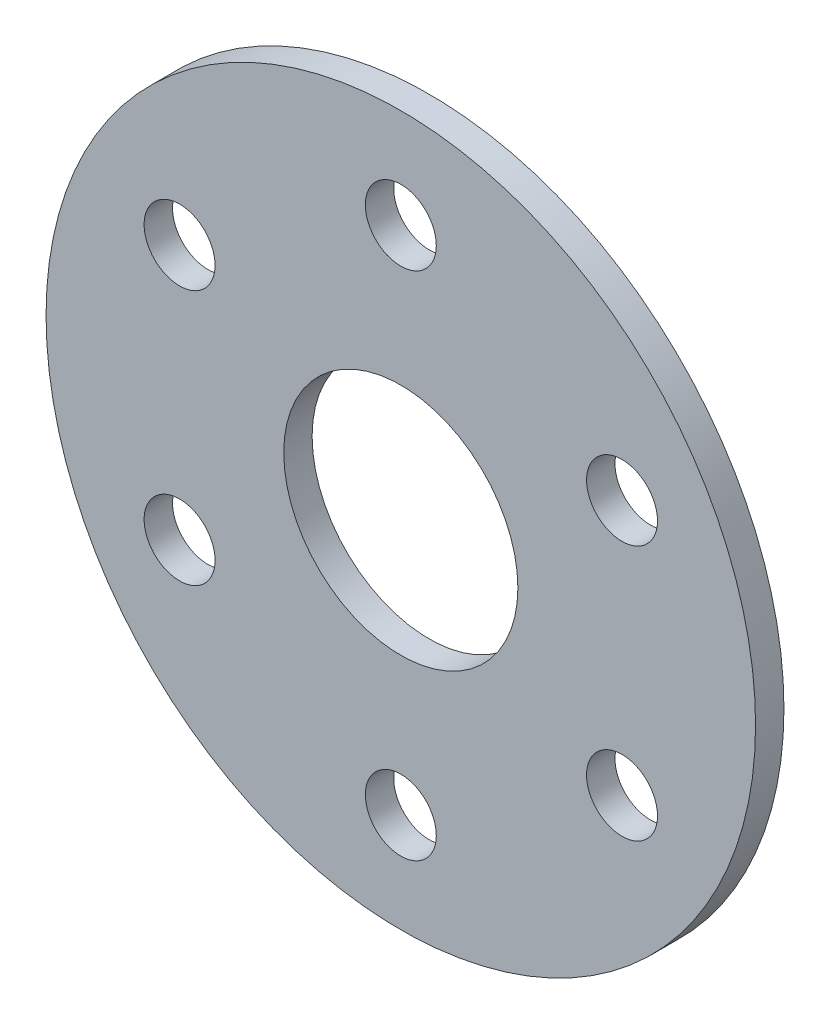
ISO-10303-21;
HEADER;
FILE_DESCRIPTION(('STEP AP214'),'2;1');
FILE_NAME('part.step','',(''),(''),'','','');
FILE_SCHEMA(('AUTOMOTIVE_DESIGN { 1 0 10303 214 1 1 1 1 }'));
ENDSEC;
DATA;
#1=APPLICATION_CONTEXT('core data for automotive mechanical design processes');
#2=APPLICATION_PROTOCOL_DEFINITION('international standard','automotive_design',2000,#1);
#3=PRODUCT_CONTEXT('',#1,'mechanical');
#4=PRODUCT('Part','Part','',(#3));
#5=PRODUCT_RELATED_PRODUCT_CATEGORY('part','',(#4));
#6=PRODUCT_DEFINITION_FORMATION('','',#4);
#7=PRODUCT_DEFINITION_CONTEXT('part definition',#1,'design');
#8=PRODUCT_DEFINITION('design','',#6,#7);
#9=PRODUCT_DEFINITION_SHAPE('','',#8);
#10=(LENGTH_UNIT() NAMED_UNIT(*) SI_UNIT(.MILLI.,.METRE.));
#11=(NAMED_UNIT(*) PLANE_ANGLE_UNIT() SI_UNIT($,.RADIAN.));
#12=(NAMED_UNIT(*) SI_UNIT($,.STERADIAN.) SOLID_ANGLE_UNIT());
#13=UNCERTAINTY_MEASURE_WITH_UNIT(LENGTH_MEASURE(1.E-05),#10,'distance_accuracy_value','');
#14=(GEOMETRIC_REPRESENTATION_CONTEXT(3) GLOBAL_UNCERTAINTY_ASSIGNED_CONTEXT((#13)) GLOBAL_UNIT_ASSIGNED_CONTEXT((#10,
#11,#12)) REPRESENTATION_CONTEXT('',''));
#15=CARTESIAN_POINT('',(0.,0.,0.));
#16=DIRECTION('',(0.,0.,1.));
#17=DIRECTION('',(1.,0.,0.));
#18=AXIS2_PLACEMENT_3D('',#15,#16,#17);
#19=CARTESIAN_POINT('',(0.,0.,1.));
#20=DIRECTION('',(0.,0.,1.));
#21=DIRECTION('',(1.,0.,0.));
#22=AXIS2_PLACEMENT_3D('',#19,#20,#21);
#23=PLANE('',#22);
#24=CARTESIAN_POINT('',(-15.5884572681176,-9.00000000000134,1.));
#25=DIRECTION('',(0.,0.,1.));
#26=DIRECTION('',(1.,0.,0.));
#27=AXIS2_PLACEMENT_3D('',#24,#25,#26);
#28=CIRCLE('',#27,2.50000000000276);
#29=CARTESIAN_POINT('',(-13.0884572681148,-9.00000000000134,1.));
#30=VERTEX_POINT('',#29);
#31=EDGE_CURVE('E74',#30,#30,#28,.T.);
#32=ORIENTED_EDGE('',*,*,#31,.F.);
#33=EDGE_LOOP('',(#32));
#34=FACE_BOUND('',#33,.T.);
#35=CARTESIAN_POINT('',(15.5884572681222,-8.99999999999867,1.));
#36=DIRECTION('',(0.,0.,1.));
#37=DIRECTION('',(1.,0.,0.));
#38=AXIS2_PLACEMENT_3D('',#35,#36,#37);
#39=CIRCLE('',#38,2.50000000000189);
#40=CARTESIAN_POINT('',(18.0884572681241,-8.99999999999867,1.));
#41=VERTEX_POINT('',#40);
#42=EDGE_CURVE('E62',#41,#41,#39,.T.);
#43=ORIENTED_EDGE('',*,*,#42,.F.);
#44=EDGE_LOOP('',(#43));
#45=FACE_BOUND('',#44,.T.);
#46=CARTESIAN_POINT('',(0.,18.,1.));
#47=DIRECTION('',(0.,0.,1.));
#48=DIRECTION('',(1.,0.,0.));
#49=AXIS2_PLACEMENT_3D('',#46,#47,#48);
#50=CIRCLE('',#49,2.5);
#51=CARTESIAN_POINT('',(2.5,18.,1.));
#52=VERTEX_POINT('',#51);
#53=EDGE_CURVE('E50',#52,#52,#50,.T.);
#54=ORIENTED_EDGE('',*,*,#53,.F.);
#55=EDGE_LOOP('',(#54));
#56=FACE_BOUND('',#55,.T.);
#57=CARTESIAN_POINT('',(0.,0.,1.));
#58=DIRECTION('',(0.,0.,1.));
#59=DIRECTION('',(1.,0.,0.));
#60=AXIS2_PLACEMENT_3D('',#57,#58,#59);
#61=CIRCLE('',#60,25.);
#62=CARTESIAN_POINT('',(25.,0.,1.));
#63=VERTEX_POINT('',#62);
#64=EDGE_CURVE('E10',#63,#63,#61,.T.);
#65=ORIENTED_EDGE('',*,*,#64,.T.);
#66=EDGE_LOOP('',(#65));
#67=FACE_BOUND('',#66,.T.);
#68=CARTESIAN_POINT('',(0.,0.,1.));
#69=DIRECTION('',(0.,0.,1.));
#70=DIRECTION('',(1.,0.,0.));
#71=AXIS2_PLACEMENT_3D('',#68,#69,#70);
#72=CIRCLE('',#71,8.25);
#73=CARTESIAN_POINT('',(8.25,0.,1.));
#74=VERTEX_POINT('',#73);
#75=EDGE_CURVE('E45',#74,#74,#72,.T.);
#76=ORIENTED_EDGE('',*,*,#75,.F.);
#77=EDGE_LOOP('',(#76));
#78=FACE_BOUND('',#77,.T.);
#79=CARTESIAN_POINT('',(15.5884572681207,9.00000000000133,1.));
#80=DIRECTION('',(0.,0.,1.));
#81=DIRECTION('',(1.,0.,0.));
#82=AXIS2_PLACEMENT_3D('',#79,#80,#81);
#83=CIRCLE('',#82,2.50000000000039);
#84=CARTESIAN_POINT('',(18.088457268121,9.00000000000133,1.));
#85=VERTEX_POINT('',#84);
#86=EDGE_CURVE('E56',#85,#85,#83,.T.);
#87=ORIENTED_EDGE('',*,*,#86,.F.);
#88=EDGE_LOOP('',(#87));
#89=FACE_BOUND('',#88,.T.);
#90=CARTESIAN_POINT('',(3.0651358900067E-12,-18.,1.));
#91=DIRECTION('',(0.,0.,1.));
#92=DIRECTION('',(1.,0.,0.));
#93=AXIS2_PLACEMENT_3D('',#90,#91,#92);
#94=CIRCLE('',#93,2.50000000000305);
#95=CARTESIAN_POINT('',(2.50000000000612,-18.,1.));
#96=VERTEX_POINT('',#95);
#97=EDGE_CURVE('E68',#96,#96,#94,.T.);
#98=ORIENTED_EDGE('',*,*,#97,.F.);
#99=EDGE_LOOP('',(#98));
#100=FACE_BOUND('',#99,.T.);
#101=CARTESIAN_POINT('',(-15.5884572681191,8.99999999999866,1.));
#102=DIRECTION('',(0.,0.,1.));
#103=DIRECTION('',(1.,0.,0.));
#104=AXIS2_PLACEMENT_3D('',#101,#102,#103);
#105=CIRCLE('',#104,2.50000000000133);
#106=CARTESIAN_POINT('',(-13.0884572681178,8.99999999999866,1.));
#107=VERTEX_POINT('',#106);
#108=EDGE_CURVE('E80',#107,#107,#105,.T.);
#109=ORIENTED_EDGE('',*,*,#108,.F.);
#110=EDGE_LOOP('',(#109));
#111=FACE_BOUND('',#110,.T.);
#112=ADVANCED_FACE('F34',(#34,#45,#56,#67,#78,#89,#100,#111),#23,.T.);
#113=CARTESIAN_POINT('',(0.,0.,-1.));
#114=DIRECTION('',(0.,0.,1.));
#115=DIRECTION('',(1.,0.,0.));
#116=AXIS2_PLACEMENT_3D('',#113,#114,#115);
#117=PLANE('',#116);
#118=CARTESIAN_POINT('',(0.,0.,-1.));
#119=DIRECTION('',(0.,0.,1.));
#120=DIRECTION('',(1.,0.,0.));
#121=AXIS2_PLACEMENT_3D('',#118,#119,#120);
#122=CIRCLE('',#121,25.);
#123=CARTESIAN_POINT('',(25.,0.,-1.));
#124=VERTEX_POINT('',#123);
#125=EDGE_CURVE('E38',#124,#124,#122,.T.);
#126=ORIENTED_EDGE('',*,*,#125,.F.);
#127=EDGE_LOOP('',(#126));
#128=FACE_BOUND('',#127,.T.);
#129=CARTESIAN_POINT('',(0.,0.,-1.));
#130=DIRECTION('',(0.,0.,1.));
#131=DIRECTION('',(1.,0.,0.));
#132=AXIS2_PLACEMENT_3D('',#129,#130,#131);
#133=CIRCLE('',#132,8.25);
#134=CARTESIAN_POINT('',(8.25,0.,-1.));
#135=VERTEX_POINT('',#134);
#136=EDGE_CURVE('E47',#135,#135,#133,.T.);
#137=ORIENTED_EDGE('',*,*,#136,.T.);
#138=EDGE_LOOP('',(#137));
#139=FACE_BOUND('',#138,.T.);
#140=CARTESIAN_POINT('',(0.,18.,-1.));
#141=DIRECTION('',(0.,0.,1.));
#142=DIRECTION('',(1.,0.,0.));
#143=AXIS2_PLACEMENT_3D('',#140,#141,#142);
#144=CIRCLE('',#143,2.5);
#145=CARTESIAN_POINT('',(2.5,18.,-1.));
#146=VERTEX_POINT('',#145);
#147=EDGE_CURVE('E53',#146,#146,#144,.T.);
#148=ORIENTED_EDGE('',*,*,#147,.T.);
#149=EDGE_LOOP('',(#148));
#150=FACE_BOUND('',#149,.T.);
#151=CARTESIAN_POINT('',(15.5884572681207,9.00000000000133,-1.));
#152=DIRECTION('',(0.,0.,1.));
#153=DIRECTION('',(1.,0.,0.));
#154=AXIS2_PLACEMENT_3D('',#151,#152,#153);
#155=CIRCLE('',#154,2.50000000000039);
#156=CARTESIAN_POINT('',(18.088457268121,9.00000000000133,-1.));
#157=VERTEX_POINT('',#156);
#158=EDGE_CURVE('E59',#157,#157,#155,.T.);
#159=ORIENTED_EDGE('',*,*,#158,.T.);
#160=EDGE_LOOP('',(#159));
#161=FACE_BOUND('',#160,.T.);
#162=CARTESIAN_POINT('',(15.5884572681222,-8.99999999999867,-1.));
#163=DIRECTION('',(0.,0.,1.));
#164=DIRECTION('',(1.,0.,0.));
#165=AXIS2_PLACEMENT_3D('',#162,#163,#164);
#166=CIRCLE('',#165,2.50000000000189);
#167=CARTESIAN_POINT('',(18.0884572681241,-8.99999999999867,-1.));
#168=VERTEX_POINT('',#167);
#169=EDGE_CURVE('E65',#168,#168,#166,.T.);
#170=ORIENTED_EDGE('',*,*,#169,.T.);
#171=EDGE_LOOP('',(#170));
#172=FACE_BOUND('',#171,.T.);
#173=CARTESIAN_POINT('',(3.0651358900067E-12,-18.,-1.));
#174=DIRECTION('',(0.,0.,1.));
#175=DIRECTION('',(1.,0.,0.));
#176=AXIS2_PLACEMENT_3D('',#173,#174,#175);
#177=CIRCLE('',#176,2.50000000000305);
#178=CARTESIAN_POINT('',(2.50000000000612,-18.,-1.));
#179=VERTEX_POINT('',#178);
#180=EDGE_CURVE('E71',#179,#179,#177,.T.);
#181=ORIENTED_EDGE('',*,*,#180,.T.);
#182=EDGE_LOOP('',(#181));
#183=FACE_BOUND('',#182,.T.);
#184=CARTESIAN_POINT('',(-15.5884572681176,-9.00000000000134,-1.));
#185=DIRECTION('',(0.,0.,1.));
#186=DIRECTION('',(1.,0.,0.));
#187=AXIS2_PLACEMENT_3D('',#184,#185,#186);
#188=CIRCLE('',#187,2.50000000000276);
#189=CARTESIAN_POINT('',(-13.0884572681148,-9.00000000000134,-1.));
#190=VERTEX_POINT('',#189);
#191=EDGE_CURVE('E77',#190,#190,#188,.T.);
#192=ORIENTED_EDGE('',*,*,#191,.T.);
#193=EDGE_LOOP('',(#192));
#194=FACE_BOUND('',#193,.T.);
#195=CARTESIAN_POINT('',(-15.5884572681191,8.99999999999866,-1.));
#196=DIRECTION('',(0.,0.,1.));
#197=DIRECTION('',(1.,0.,0.));
#198=AXIS2_PLACEMENT_3D('',#195,#196,#197);
#199=CIRCLE('',#198,2.50000000000133);
#200=CARTESIAN_POINT('',(-13.0884572681178,8.99999999999866,-1.));
#201=VERTEX_POINT('',#200);
#202=EDGE_CURVE('E83',#201,#201,#199,.T.);
#203=ORIENTED_EDGE('',*,*,#202,.T.);
#204=EDGE_LOOP('',(#203));
#205=FACE_BOUND('',#204,.T.);
#206=ADVANCED_FACE('F93',(#128,#139,#150,#161,#172,#183,#194,#205),#117,.F.);
#207=CARTESIAN_POINT('',(0.,0.,1.));
#208=DIRECTION('',(0.,0.,-1.));
#209=DIRECTION('',(-1.,0.,0.));
#210=AXIS2_PLACEMENT_3D('',#207,#208,#209);
#211=CYLINDRICAL_SURFACE('',#210,25.);
#212=ORIENTED_EDGE('',*,*,#64,.F.);
#213=EDGE_LOOP('',(#212));
#214=FACE_BOUND('',#213,.T.);
#215=ORIENTED_EDGE('',*,*,#125,.T.);
#216=EDGE_LOOP('',(#215));
#217=FACE_BOUND('',#216,.T.);
#218=ADVANCED_FACE('F36',(#214,#217),#211,.T.);
#219=CARTESIAN_POINT('',(0.,0.,1.));
#220=DIRECTION('',(0.,0.,-1.));
#221=DIRECTION('',(-1.,0.,0.));
#222=AXIS2_PLACEMENT_3D('',#219,#220,#221);
#223=CYLINDRICAL_SURFACE('',#222,8.25);
#224=ORIENTED_EDGE('',*,*,#75,.T.);
#225=EDGE_LOOP('',(#224));
#226=FACE_BOUND('',#225,.T.);
#227=ORIENTED_EDGE('',*,*,#136,.F.);
#228=EDGE_LOOP('',(#227));
#229=FACE_BOUND('',#228,.T.);
#230=ADVANCED_FACE('F103',(#226,#229),#223,.F.);
#231=CARTESIAN_POINT('',(0.,18.,1.));
#232=DIRECTION('',(0.,0.,-1.));
#233=DIRECTION('',(-1.,0.,0.));
#234=AXIS2_PLACEMENT_3D('',#231,#232,#233);
#235=CYLINDRICAL_SURFACE('',#234,2.5);
#236=ORIENTED_EDGE('',*,*,#53,.T.);
#237=EDGE_LOOP('',(#236));
#238=FACE_BOUND('',#237,.T.);
#239=ORIENTED_EDGE('',*,*,#147,.F.);
#240=EDGE_LOOP('',(#239));
#241=FACE_BOUND('',#240,.T.);
#242=ADVANCED_FACE('F106',(#238,#241),#235,.F.);
#243=CARTESIAN_POINT('',(15.5884572681207,9.00000000000133,1.));
#244=DIRECTION('',(0.,0.,-1.));
#245=DIRECTION('',(-1.,0.,0.));
#246=AXIS2_PLACEMENT_3D('',#243,#244,#245);
#247=CYLINDRICAL_SURFACE('',#246,2.50000000000039);
#248=ORIENTED_EDGE('',*,*,#86,.T.);
#249=EDGE_LOOP('',(#248));
#250=FACE_BOUND('',#249,.T.);
#251=ORIENTED_EDGE('',*,*,#158,.F.);
#252=EDGE_LOOP('',(#251));
#253=FACE_BOUND('',#252,.T.);
#254=ADVANCED_FACE('F110',(#250,#253),#247,.F.);
#255=CARTESIAN_POINT('',(15.5884572681222,-8.99999999999867,1.));
#256=DIRECTION('',(0.,0.,-1.));
#257=DIRECTION('',(-1.,0.,0.));
#258=AXIS2_PLACEMENT_3D('',#255,#256,#257);
#259=CYLINDRICAL_SURFACE('',#258,2.50000000000189);
#260=ORIENTED_EDGE('',*,*,#42,.T.);
#261=EDGE_LOOP('',(#260));
#262=FACE_BOUND('',#261,.T.);
#263=ORIENTED_EDGE('',*,*,#169,.F.);
#264=EDGE_LOOP('',(#263));
#265=FACE_BOUND('',#264,.T.);
#266=ADVANCED_FACE('F114',(#262,#265),#259,.F.);
#267=CARTESIAN_POINT('',(3.0651358900067E-12,-18.,1.));
#268=DIRECTION('',(0.,0.,-1.));
#269=DIRECTION('',(-1.,0.,0.));
#270=AXIS2_PLACEMENT_3D('',#267,#268,#269);
#271=CYLINDRICAL_SURFACE('',#270,2.50000000000305);
#272=ORIENTED_EDGE('',*,*,#97,.T.);
#273=EDGE_LOOP('',(#272));
#274=FACE_BOUND('',#273,.T.);
#275=ORIENTED_EDGE('',*,*,#180,.F.);
#276=EDGE_LOOP('',(#275));
#277=FACE_BOUND('',#276,.T.);
#278=ADVANCED_FACE('F118',(#274,#277),#271,.F.);
#279=CARTESIAN_POINT('',(-15.5884572681176,-9.00000000000134,1.));
#280=DIRECTION('',(0.,0.,-1.));
#281=DIRECTION('',(-1.,0.,0.));
#282=AXIS2_PLACEMENT_3D('',#279,#280,#281);
#283=CYLINDRICAL_SURFACE('',#282,2.50000000000276);
#284=ORIENTED_EDGE('',*,*,#31,.T.);
#285=EDGE_LOOP('',(#284));
#286=FACE_BOUND('',#285,.T.);
#287=ORIENTED_EDGE('',*,*,#191,.F.);
#288=EDGE_LOOP('',(#287));
#289=FACE_BOUND('',#288,.T.);
#290=ADVANCED_FACE('F122',(#286,#289),#283,.F.);
#291=CARTESIAN_POINT('',(-15.5884572681191,8.99999999999866,1.));
#292=DIRECTION('',(0.,0.,-1.));
#293=DIRECTION('',(-1.,0.,0.));
#294=AXIS2_PLACEMENT_3D('',#291,#292,#293);
#295=CYLINDRICAL_SURFACE('',#294,2.50000000000133);
#296=ORIENTED_EDGE('',*,*,#108,.T.);
#297=EDGE_LOOP('',(#296));
#298=FACE_BOUND('',#297,.T.);
#299=ORIENTED_EDGE('',*,*,#202,.F.);
#300=EDGE_LOOP('',(#299));
#301=FACE_BOUND('',#300,.T.);
#302=ADVANCED_FACE('F89',(#298,#301),#295,.F.);
#303=CLOSED_SHELL('',(#112,#206,#218,#230,#242,#254,#266,#278,#290,#302));
#304=MANIFOLD_SOLID_BREP('B2',#303);
#305=ADVANCED_BREP_SHAPE_REPRESENTATION('',(#18,#304),#14);
#306=SHAPE_DEFINITION_REPRESENTATION(#9,#305);
ENDSEC;
END-ISO-10303-21;
